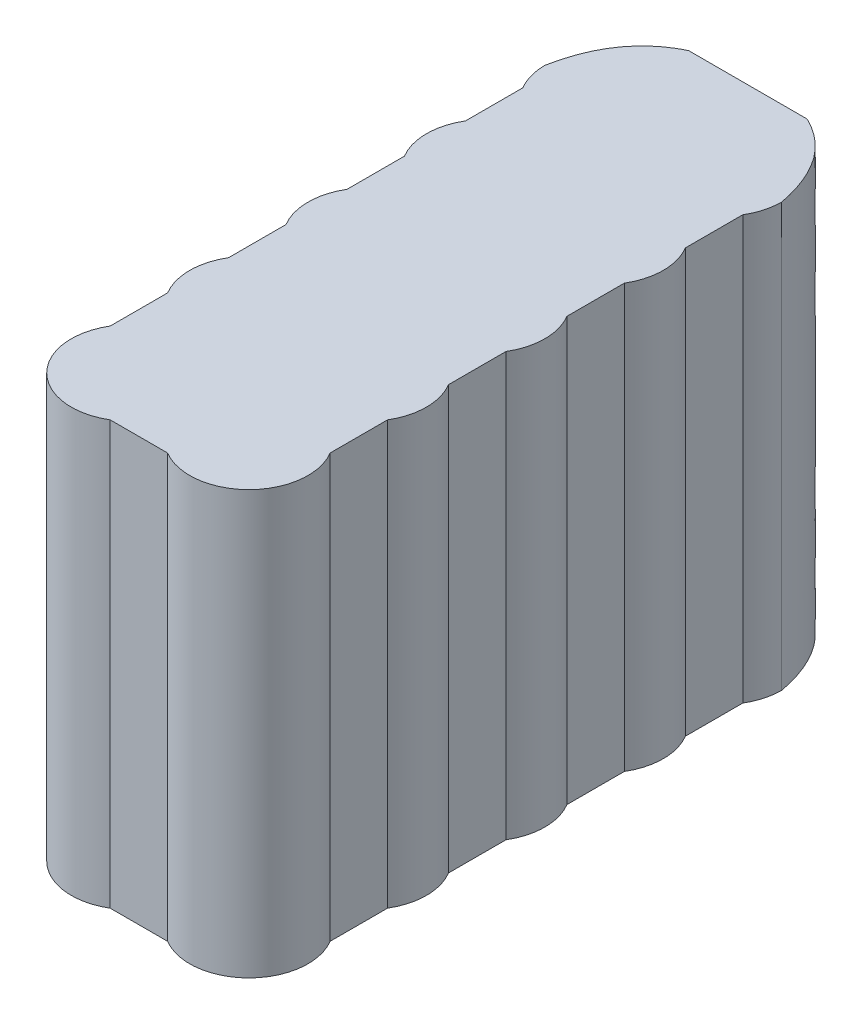
ISO-10303-21;
HEADER;
FILE_DESCRIPTION(('STEP AP214'),'2;1');
FILE_NAME('part.step','',(''),(''),'','','');
FILE_SCHEMA(('AUTOMOTIVE_DESIGN { 1 0 10303 214 1 1 1 1 }'));
ENDSEC;
DATA;
#1=APPLICATION_CONTEXT('core data for automotive mechanical design processes');
#2=APPLICATION_PROTOCOL_DEFINITION('international standard','automotive_design',2000,#1);
#3=PRODUCT_CONTEXT('',#1,'mechanical');
#4=PRODUCT('Part','Part','',(#3));
#5=PRODUCT_RELATED_PRODUCT_CATEGORY('part','',(#4));
#6=PRODUCT_DEFINITION_FORMATION('','',#4);
#7=PRODUCT_DEFINITION_CONTEXT('part definition',#1,'design');
#8=PRODUCT_DEFINITION('design','',#6,#7);
#9=PRODUCT_DEFINITION_SHAPE('','',#8);
#10=(LENGTH_UNIT() NAMED_UNIT(*) SI_UNIT(.MILLI.,.METRE.));
#11=(NAMED_UNIT(*) PLANE_ANGLE_UNIT() SI_UNIT($,.RADIAN.));
#12=(NAMED_UNIT(*) SI_UNIT($,.STERADIAN.) SOLID_ANGLE_UNIT());
#13=UNCERTAINTY_MEASURE_WITH_UNIT(LENGTH_MEASURE(1.E-05),#10,'distance_accuracy_value','');
#14=(GEOMETRIC_REPRESENTATION_CONTEXT(3) GLOBAL_UNCERTAINTY_ASSIGNED_CONTEXT((#13)) GLOBAL_UNIT_ASSIGNED_CONTEXT((#10,
#11,#12)) REPRESENTATION_CONTEXT('',''));
#15=CARTESIAN_POINT('',(0.,0.,0.));
#16=DIRECTION('',(0.,0.,1.));
#17=DIRECTION('',(1.,0.,0.));
#18=AXIS2_PLACEMENT_3D('',#15,#16,#17);
#19=CARTESIAN_POINT('',(7.00000000000001,50.,-38.));
#20=CARTESIAN_POINT('',(12.5964188115589,50.,-35.3289126191777));
#21=CARTESIAN_POINT('',(14.,50.,-27.9999999999999));
#22=B_SPLINE_CURVE_WITH_KNOTS('',2,(#19,#20,#21),.UNSPECIFIED.,.F.,.F.,(3,3),(0.6822294465507,
1.),.UNSPECIFIED.);
#23=DIRECTION('',(0.,-1.,0.));
#24=VECTOR('',#23,1.);
#25=SURFACE_OF_LINEAR_EXTRUSION('',#22,#24);
#26=CARTESIAN_POINT('',(7.00000000000001,0.,-38.));
#27=CARTESIAN_POINT('',(12.5964188115589,0.,-35.3289126191777));
#28=CARTESIAN_POINT('',(14.,0.,-27.9999999999999));
#29=B_SPLINE_CURVE_WITH_KNOTS('',2,(#26,#27,#28),.UNSPECIFIED.,.F.,.F.,(3,3),(0.6822294465507,
1.),.UNSPECIFIED.);
#30=CARTESIAN_POINT('',(7.00000000000001,0.,-38.));
#31=VERTEX_POINT('',#30);
#32=CARTESIAN_POINT('',(14.,0.,-27.9999999999999));
#33=VERTEX_POINT('',#32);
#34=EDGE_CURVE('E211',#31,#33,#29,.T.);
#35=ORIENTED_EDGE('',*,*,#34,.F.);
#36=DIRECTION('',(0.,-1.,0.));
#37=VECTOR('',#36,1.);
#38=CARTESIAN_POINT('',(7.00000000000001,50.,-38.));
#39=LINE('',#38,#37);
#40=CARTESIAN_POINT('',(7.00000000000001,50.,-38.));
#41=VERTEX_POINT('',#40);
#42=EDGE_CURVE('E11',#41,#31,#39,.T.);
#43=ORIENTED_EDGE('',*,*,#42,.F.);
#44=CARTESIAN_POINT('',(14.,50.,-27.9999999999999));
#45=VERTEX_POINT('',#44);
#46=EDGE_CURVE('E273',#41,#45,#22,.T.);
#47=ORIENTED_EDGE('',*,*,#46,.T.);
#48=DIRECTION('',(0.,-1.,0.));
#49=VECTOR('',#48,1.);
#50=CARTESIAN_POINT('',(14.,50.,-27.9999999999999));
#51=LINE('',#50,#49);
#52=EDGE_CURVE('E126',#45,#33,#51,.T.);
#53=ORIENTED_EDGE('',*,*,#52,.T.);
#54=EDGE_LOOP('',(#35,#43,#47,#53));
#55=FACE_BOUND('',#54,.T.);
#56=ADVANCED_FACE('F33',(#55),#25,.T.);
#57=CARTESIAN_POINT('',(0.,50.,-38.));
#58=DIRECTION('',(0.,0.,1.));
#59=DIRECTION('',(1.,0.,0.));
#60=AXIS2_PLACEMENT_3D('',#57,#58,#59);
#61=PLANE('',#60);
#62=DIRECTION('',(-1.,0.,0.));
#63=VECTOR('',#62,1.);
#64=CARTESIAN_POINT('',(0.,0.,-38.));
#65=LINE('',#64,#63);
#66=CARTESIAN_POINT('',(-6.99999999999999,0.,-38.));
#67=VERTEX_POINT('',#66);
#68=EDGE_CURVE('E216',#31,#67,#65,.T.);
#69=ORIENTED_EDGE('',*,*,#68,.T.);
#70=DIRECTION('',(0.,-1.,0.));
#71=VECTOR('',#70,1.);
#72=CARTESIAN_POINT('',(-6.99999999999999,50.,-38.));
#73=LINE('',#72,#71);
#74=CARTESIAN_POINT('',(-6.99999999999999,50.,-38.));
#75=VERTEX_POINT('',#74);
#76=EDGE_CURVE('E42',#75,#67,#73,.T.);
#77=ORIENTED_EDGE('',*,*,#76,.F.);
#78=DIRECTION('',(-1.,0.,0.));
#79=VECTOR('',#78,1.);
#80=CARTESIAN_POINT('',(0.,50.,-38.));
#81=LINE('',#80,#79);
#82=EDGE_CURVE('E381',#41,#75,#81,.T.);
#83=ORIENTED_EDGE('',*,*,#82,.F.);
#84=ORIENTED_EDGE('',*,*,#42,.T.);
#85=EDGE_LOOP('',(#69,#77,#83,#84));
#86=FACE_BOUND('',#85,.T.);
#87=ADVANCED_FACE('F327',(#86),#61,.F.);
#88=CARTESIAN_POINT('',(-14.,50.,-27.9999999999999));
#89=CARTESIAN_POINT('',(-12.5964188115868,50.,-35.3289126191844));
#90=CARTESIAN_POINT('',(-6.99999999999999,50.,-38.));
#91=B_SPLINE_CURVE_WITH_KNOTS('',2,(#88,#89,#90),.UNSPECIFIED.,.F.,.F.,(3,3),(0.,
0.317770553450376),.UNSPECIFIED.);
#92=DIRECTION('',(0.,-1.,0.));
#93=VECTOR('',#92,1.);
#94=SURFACE_OF_LINEAR_EXTRUSION('',#91,#93);
#95=CARTESIAN_POINT('',(-14.,0.,-27.9999999999999));
#96=CARTESIAN_POINT('',(-12.5964188115868,0.,-35.3289126191844));
#97=CARTESIAN_POINT('',(-6.99999999999999,0.,-38.));
#98=B_SPLINE_CURVE_WITH_KNOTS('',2,(#95,#96,#97),.UNSPECIFIED.,.F.,.F.,(3,3),(0.,
0.317770553450376),.UNSPECIFIED.);
#99=CARTESIAN_POINT('',(-14.,0.,-27.9999999999999));
#100=VERTEX_POINT('',#99);
#101=EDGE_CURVE('E222',#100,#67,#98,.T.);
#102=ORIENTED_EDGE('',*,*,#101,.F.);
#103=DIRECTION('',(0.,-1.,0.));
#104=VECTOR('',#103,1.);
#105=CARTESIAN_POINT('',(-14.,50.,-27.9999999999999));
#106=LINE('',#105,#104);
#107=CARTESIAN_POINT('',(-14.,50.,-27.9999999999999));
#108=VERTEX_POINT('',#107);
#109=EDGE_CURVE('E317',#108,#100,#106,.T.);
#110=ORIENTED_EDGE('',*,*,#109,.F.);
#111=EDGE_CURVE('E324',#108,#75,#91,.T.);
#112=ORIENTED_EDGE('',*,*,#111,.T.);
#113=ORIENTED_EDGE('',*,*,#76,.T.);
#114=EDGE_LOOP('',(#102,#110,#112,#113));
#115=FACE_BOUND('',#114,.T.);
#116=ADVANCED_FACE('F322',(#115),#94,.T.);
#117=CARTESIAN_POINT('',(-6.99999999999999,50.,-27.9999999999999));
#118=DIRECTION('',(0.,-1.,0.));
#119=DIRECTION('',(0.,0.,-1.));
#120=AXIS2_PLACEMENT_3D('',#117,#118,#119);
#121=CYLINDRICAL_SURFACE('',#120,7.00000000000002);
#122=CARTESIAN_POINT('',(-6.99999999999999,0.,-27.9999999999999));
#123=DIRECTION('',(0.,1.,0.));
#124=DIRECTION('',(0.,0.,1.));
#125=AXIS2_PLACEMENT_3D('',#122,#123,#124);
#126=CIRCLE('',#125,7.00000000000002);
#127=CARTESIAN_POINT('',(-13.,0.,-24.3944487245359));
#128=VERTEX_POINT('',#127);
#129=EDGE_CURVE('E227',#100,#128,#126,.T.);
#130=ORIENTED_EDGE('',*,*,#129,.T.);
#131=DIRECTION('',(0.,-1.,0.));
#132=VECTOR('',#131,1.);
#133=CARTESIAN_POINT('',(-13.,50.,-24.3944487245359));
#134=LINE('',#133,#132);
#135=CARTESIAN_POINT('',(-13.,50.,-24.3944487245359));
#136=VERTEX_POINT('',#135);
#137=EDGE_CURVE('E314',#136,#128,#134,.T.);
#138=ORIENTED_EDGE('',*,*,#137,.F.);
#139=CARTESIAN_POINT('',(-6.99999999999999,50.,-27.9999999999999));
#140=DIRECTION('',(0.,1.,0.));
#141=DIRECTION('',(0.,0.,1.));
#142=AXIS2_PLACEMENT_3D('',#139,#140,#141);
#143=CIRCLE('',#142,7.00000000000002);
#144=EDGE_CURVE('E344',#108,#136,#143,.T.);
#145=ORIENTED_EDGE('',*,*,#144,.F.);
#146=ORIENTED_EDGE('',*,*,#109,.T.);
#147=EDGE_LOOP('',(#130,#138,#145,#146));
#148=FACE_BOUND('',#147,.T.);
#149=ADVANCED_FACE('F335',(#148),#121,.T.);
#150=CARTESIAN_POINT('',(-13.,50.,0.));
#151=DIRECTION('',(1.,0.,0.));
#152=DIRECTION('',(0.,0.,-1.));
#153=AXIS2_PLACEMENT_3D('',#150,#151,#152);
#154=PLANE('',#153);
#155=DIRECTION('',(0.,0.,1.));
#156=VECTOR('',#155,1.);
#157=CARTESIAN_POINT('',(-13.,0.,0.));
#158=LINE('',#157,#156);
#159=CARTESIAN_POINT('',(-13.,0.,-17.6055512754637));
#160=VERTEX_POINT('',#159);
#161=EDGE_CURVE('E232',#128,#160,#158,.T.);
#162=ORIENTED_EDGE('',*,*,#161,.T.);
#163=DIRECTION('',(0.,-1.,0.));
#164=VECTOR('',#163,1.);
#165=CARTESIAN_POINT('',(-13.,50.,-17.6055512754637));
#166=LINE('',#165,#164);
#167=CARTESIAN_POINT('',(-13.,50.,-17.6055512754637));
#168=VERTEX_POINT('',#167);
#169=EDGE_CURVE('E311',#168,#160,#166,.T.);
#170=ORIENTED_EDGE('',*,*,#169,.F.);
#171=DIRECTION('',(0.,0.,1.));
#172=VECTOR('',#171,1.);
#173=CARTESIAN_POINT('',(-13.,50.,0.));
#174=LINE('',#173,#172);
#175=EDGE_CURVE('E341',#136,#168,#174,.T.);
#176=ORIENTED_EDGE('',*,*,#175,.F.);
#177=ORIENTED_EDGE('',*,*,#137,.T.);
#178=EDGE_LOOP('',(#162,#170,#176,#177));
#179=FACE_BOUND('',#178,.T.);
#180=ADVANCED_FACE('F339',(#179),#154,.F.);
#181=CARTESIAN_POINT('',(-6.99999999999985,50.,-13.9999999999999));
#182=DIRECTION('',(0.,-1.,0.));
#183=DIRECTION('',(0.,0.,-1.));
#184=AXIS2_PLACEMENT_3D('',#181,#182,#183);
#185=CYLINDRICAL_SURFACE('',#184,7.);
#186=CARTESIAN_POINT('',(-6.99999999999985,0.,-13.9999999999999));
#187=DIRECTION('',(0.,1.,0.));
#188=DIRECTION('',(0.,0.,1.));
#189=AXIS2_PLACEMENT_3D('',#186,#187,#188);
#190=CIRCLE('',#189,7.);
#191=CARTESIAN_POINT('',(-13.,0.,-10.3944487245362));
#192=VERTEX_POINT('',#191);
#193=EDGE_CURVE('E234',#160,#192,#190,.T.);
#194=ORIENTED_EDGE('',*,*,#193,.T.);
#195=DIRECTION('',(0.,-1.,0.));
#196=VECTOR('',#195,1.);
#197=CARTESIAN_POINT('',(-13.,50.,-10.3944487245362));
#198=LINE('',#197,#196);
#199=CARTESIAN_POINT('',(-13.,50.,-10.3944487245362));
#200=VERTEX_POINT('',#199);
#201=EDGE_CURVE('E308',#200,#192,#198,.T.);
#202=ORIENTED_EDGE('',*,*,#201,.F.);
#203=CARTESIAN_POINT('',(-6.99999999999985,50.,-13.9999999999999));
#204=DIRECTION('',(0.,1.,0.));
#205=DIRECTION('',(0.,0.,1.));
#206=AXIS2_PLACEMENT_3D('',#203,#204,#205);
#207=CIRCLE('',#206,7.);
#208=EDGE_CURVE('E343',#168,#200,#207,.T.);
#209=ORIENTED_EDGE('',*,*,#208,.F.);
#210=ORIENTED_EDGE('',*,*,#169,.T.);
#211=EDGE_LOOP('',(#194,#202,#209,#210));
#212=FACE_BOUND('',#211,.T.);
#213=ADVANCED_FACE('F431',(#212),#185,.T.);
#214=CARTESIAN_POINT('',(-13.,50.,0.));
#215=DIRECTION('',(1.,0.,0.));
#216=DIRECTION('',(0.,0.,-1.));
#217=AXIS2_PLACEMENT_3D('',#214,#215,#216);
#218=PLANE('',#217);
#219=DIRECTION('',(0.,0.,1.));
#220=VECTOR('',#219,1.);
#221=CARTESIAN_POINT('',(-13.,0.,0.));
#222=LINE('',#221,#220);
#223=CARTESIAN_POINT('',(-13.,0.,-3.60555127546341));
#224=VERTEX_POINT('',#223);
#225=EDGE_CURVE('E236',#192,#224,#222,.T.);
#226=ORIENTED_EDGE('',*,*,#225,.T.);
#227=DIRECTION('',(0.,-1.,0.));
#228=VECTOR('',#227,1.);
#229=CARTESIAN_POINT('',(-13.,50.,-3.60555127546341));
#230=LINE('',#229,#228);
#231=CARTESIAN_POINT('',(-13.,50.,-3.60555127546341));
#232=VERTEX_POINT('',#231);
#233=EDGE_CURVE('E305',#232,#224,#230,.T.);
#234=ORIENTED_EDGE('',*,*,#233,.F.);
#235=DIRECTION('',(0.,0.,1.));
#236=VECTOR('',#235,1.);
#237=CARTESIAN_POINT('',(-13.,50.,0.));
#238=LINE('',#237,#236);
#239=EDGE_CURVE('E346',#200,#232,#238,.T.);
#240=ORIENTED_EDGE('',*,*,#239,.F.);
#241=ORIENTED_EDGE('',*,*,#201,.T.);
#242=EDGE_LOOP('',(#226,#234,#240,#241));
#243=FACE_BOUND('',#242,.T.);
#244=ADVANCED_FACE('F439',(#243),#218,.F.);
#245=CARTESIAN_POINT('',(-6.9999999999997,50.,0.));
#246=DIRECTION('',(0.,-1.,0.));
#247=DIRECTION('',(0.,0.,-1.));
#248=AXIS2_PLACEMENT_3D('',#245,#246,#247);
#249=CYLINDRICAL_SURFACE('',#248,7.);
#250=CARTESIAN_POINT('',(-6.9999999999997,0.,0.));
#251=DIRECTION('',(0.,1.,0.));
#252=DIRECTION('',(0.,0.,1.));
#253=AXIS2_PLACEMENT_3D('',#250,#251,#252);
#254=CIRCLE('',#253,7.);
#255=CARTESIAN_POINT('',(-13.,0.,3.6055512754636));
#256=VERTEX_POINT('',#255);
#257=EDGE_CURVE('E238',#224,#256,#254,.T.);
#258=ORIENTED_EDGE('',*,*,#257,.T.);
#259=DIRECTION('',(0.,-1.,0.));
#260=VECTOR('',#259,1.);
#261=CARTESIAN_POINT('',(-13.,50.,3.6055512754636));
#262=LINE('',#261,#260);
#263=CARTESIAN_POINT('',(-13.,50.,3.6055512754636));
#264=VERTEX_POINT('',#263);
#265=EDGE_CURVE('E302',#264,#256,#262,.T.);
#266=ORIENTED_EDGE('',*,*,#265,.F.);
#267=CARTESIAN_POINT('',(-6.9999999999997,50.,0.));
#268=DIRECTION('',(0.,1.,0.));
#269=DIRECTION('',(0.,0.,1.));
#270=AXIS2_PLACEMENT_3D('',#267,#268,#269);
#271=CIRCLE('',#270,7.);
#272=EDGE_CURVE('E352',#232,#264,#271,.T.);
#273=ORIENTED_EDGE('',*,*,#272,.F.);
#274=ORIENTED_EDGE('',*,*,#233,.T.);
#275=EDGE_LOOP('',(#258,#266,#273,#274));
#276=FACE_BOUND('',#275,.T.);
#277=ADVANCED_FACE('F449',(#276),#249,.T.);
#278=CARTESIAN_POINT('',(-13.,50.,0.));
#279=DIRECTION('',(1.,0.,0.));
#280=DIRECTION('',(0.,0.,-1.));
#281=AXIS2_PLACEMENT_3D('',#278,#279,#280);
#282=PLANE('',#281);
#283=DIRECTION('',(0.,0.,1.));
#284=VECTOR('',#283,1.);
#285=CARTESIAN_POINT('',(-13.,0.,0.));
#286=LINE('',#285,#284);
#287=CARTESIAN_POINT('',(-13.,0.,10.3944487245368));
#288=VERTEX_POINT('',#287);
#289=EDGE_CURVE('E240',#256,#288,#286,.T.);
#290=ORIENTED_EDGE('',*,*,#289,.T.);
#291=DIRECTION('',(0.,-1.,0.));
#292=VECTOR('',#291,1.);
#293=CARTESIAN_POINT('',(-13.,50.,10.3944487245368));
#294=LINE('',#293,#292);
#295=CARTESIAN_POINT('',(-13.,50.,10.3944487245368));
#296=VERTEX_POINT('',#295);
#297=EDGE_CURVE('E299',#296,#288,#294,.T.);
#298=ORIENTED_EDGE('',*,*,#297,.F.);
#299=DIRECTION('',(0.,0.,1.));
#300=VECTOR('',#299,1.);
#301=CARTESIAN_POINT('',(-13.,50.,0.));
#302=LINE('',#301,#300);
#303=EDGE_CURVE('E354',#264,#296,#302,.T.);
#304=ORIENTED_EDGE('',*,*,#303,.F.);
#305=ORIENTED_EDGE('',*,*,#265,.T.);
#306=EDGE_LOOP('',(#290,#298,#304,#305));
#307=FACE_BOUND('',#306,.T.);
#308=ADVANCED_FACE('F459',(#307),#282,.F.);
#309=CARTESIAN_POINT('',(-6.99999999999956,50.,14.0000000000001));
#310=DIRECTION('',(0.,-1.,0.));
#311=DIRECTION('',(0.,0.,-1.));
#312=AXIS2_PLACEMENT_3D('',#309,#310,#311);
#313=CYLINDRICAL_SURFACE('',#312,7.);
#314=CARTESIAN_POINT('',(-6.99999999999956,0.,14.0000000000001));
#315=DIRECTION('',(0.,1.,0.));
#316=DIRECTION('',(0.,0.,1.));
#317=AXIS2_PLACEMENT_3D('',#314,#315,#316);
#318=CIRCLE('',#317,7.);
#319=CARTESIAN_POINT('',(-13.,0.,17.6055512754634));
#320=VERTEX_POINT('',#319);
#321=EDGE_CURVE('E242',#288,#320,#318,.T.);
#322=ORIENTED_EDGE('',*,*,#321,.T.);
#323=DIRECTION('',(0.,-1.,0.));
#324=VECTOR('',#323,1.);
#325=CARTESIAN_POINT('',(-13.,50.,17.6055512754634));
#326=LINE('',#325,#324);
#327=CARTESIAN_POINT('',(-13.,50.,17.6055512754634));
#328=VERTEX_POINT('',#327);
#329=EDGE_CURVE('E296',#328,#320,#326,.T.);
#330=ORIENTED_EDGE('',*,*,#329,.F.);
#331=CARTESIAN_POINT('',(-6.99999999999956,50.,14.0000000000001));
#332=DIRECTION('',(0.,1.,0.));
#333=DIRECTION('',(0.,0.,1.));
#334=AXIS2_PLACEMENT_3D('',#331,#332,#333);
#335=CIRCLE('',#334,7.);
#336=EDGE_CURVE('E356',#296,#328,#335,.T.);
#337=ORIENTED_EDGE('',*,*,#336,.F.);
#338=ORIENTED_EDGE('',*,*,#297,.T.);
#339=EDGE_LOOP('',(#322,#330,#337,#338));
#340=FACE_BOUND('',#339,.T.);
#341=ADVANCED_FACE('F469',(#340),#313,.T.);
#342=CARTESIAN_POINT('',(-13.,50.,0.));
#343=DIRECTION('',(1.,0.,0.));
#344=DIRECTION('',(0.,0.,-1.));
#345=AXIS2_PLACEMENT_3D('',#342,#343,#344);
#346=PLANE('',#345);
#347=DIRECTION('',(0.,0.,1.));
#348=VECTOR('',#347,1.);
#349=CARTESIAN_POINT('',(-13.,0.,0.));
#350=LINE('',#349,#348);
#351=CARTESIAN_POINT('',(-13.,0.,24.3944487245371));
#352=VERTEX_POINT('',#351);
#353=EDGE_CURVE('E244',#320,#352,#350,.T.);
#354=ORIENTED_EDGE('',*,*,#353,.T.);
#355=DIRECTION('',(0.,-1.,0.));
#356=VECTOR('',#355,1.);
#357=CARTESIAN_POINT('',(-13.,50.,24.3944487245371));
#358=LINE('',#357,#356);
#359=CARTESIAN_POINT('',(-13.,50.,24.3944487245371));
#360=VERTEX_POINT('',#359);
#361=EDGE_CURVE('E293',#360,#352,#358,.T.);
#362=ORIENTED_EDGE('',*,*,#361,.F.);
#363=DIRECTION('',(0.,0.,1.));
#364=VECTOR('',#363,1.);
#365=CARTESIAN_POINT('',(-13.,50.,0.));
#366=LINE('',#365,#364);
#367=EDGE_CURVE('E358',#328,#360,#366,.T.);
#368=ORIENTED_EDGE('',*,*,#367,.F.);
#369=ORIENTED_EDGE('',*,*,#329,.T.);
#370=EDGE_LOOP('',(#354,#362,#368,#369));
#371=FACE_BOUND('',#370,.T.);
#372=ADVANCED_FACE('F479',(#371),#346,.F.);
#373=CARTESIAN_POINT('',(-6.99999999999941,50.,28.0000000000001));
#374=DIRECTION('',(0.,-1.,0.));
#375=DIRECTION('',(0.,0.,-1.));
#376=AXIS2_PLACEMENT_3D('',#373,#374,#375);
#377=CYLINDRICAL_SURFACE('',#376,7.);
#378=CARTESIAN_POINT('',(-6.99999999999941,0.,28.0000000000001));
#379=DIRECTION('',(0.,1.,0.));
#380=DIRECTION('',(0.,0.,1.));
#381=AXIS2_PLACEMENT_3D('',#378,#379,#380);
#382=CIRCLE('',#381,7.);
#383=CARTESIAN_POINT('',(-3.39444872453527,0.,34.));
#384=VERTEX_POINT('',#383);
#385=EDGE_CURVE('E246',#352,#384,#382,.T.);
#386=ORIENTED_EDGE('',*,*,#385,.T.);
#387=DIRECTION('',(0.,-1.,0.));
#388=VECTOR('',#387,1.);
#389=CARTESIAN_POINT('',(-3.39444872453527,50.,34.));
#390=LINE('',#389,#388);
#391=CARTESIAN_POINT('',(-3.39444872453527,50.,34.));
#392=VERTEX_POINT('',#391);
#393=EDGE_CURVE('E290',#392,#384,#390,.T.);
#394=ORIENTED_EDGE('',*,*,#393,.F.);
#395=CARTESIAN_POINT('',(-6.99999999999941,50.,28.0000000000001));
#396=DIRECTION('',(0.,1.,0.));
#397=DIRECTION('',(0.,0.,1.));
#398=AXIS2_PLACEMENT_3D('',#395,#396,#397);
#399=CIRCLE('',#398,7.);
#400=EDGE_CURVE('E360',#360,#392,#399,.T.);
#401=ORIENTED_EDGE('',*,*,#400,.F.);
#402=ORIENTED_EDGE('',*,*,#361,.T.);
#403=EDGE_LOOP('',(#386,#394,#401,#402));
#404=FACE_BOUND('',#403,.T.);
#405=ADVANCED_FACE('F489',(#404),#377,.T.);
#406=CARTESIAN_POINT('',(0.,50.,34.));
#407=DIRECTION('',(0.,0.,-1.));
#408=DIRECTION('',(-1.,0.,0.));
#409=AXIS2_PLACEMENT_3D('',#406,#407,#408);
#410=PLANE('',#409);
#411=DIRECTION('',(1.,0.,0.));
#412=VECTOR('',#411,1.);
#413=CARTESIAN_POINT('',(0.,0.,34.));
#414=LINE('',#413,#412);
#415=CARTESIAN_POINT('',(3.39444872453661,0.,34.));
#416=VERTEX_POINT('',#415);
#417=EDGE_CURVE('E248',#384,#416,#414,.T.);
#418=ORIENTED_EDGE('',*,*,#417,.T.);
#419=DIRECTION('',(0.,-1.,0.));
#420=VECTOR('',#419,1.);
#421=CARTESIAN_POINT('',(3.39444872453661,50.,34.));
#422=LINE('',#421,#420);
#423=CARTESIAN_POINT('',(3.39444872453661,50.,34.));
#424=VERTEX_POINT('',#423);
#425=EDGE_CURVE('E287',#424,#416,#422,.T.);
#426=ORIENTED_EDGE('',*,*,#425,.F.);
#427=DIRECTION('',(1.,0.,0.));
#428=VECTOR('',#427,1.);
#429=CARTESIAN_POINT('',(0.,50.,34.));
#430=LINE('',#429,#428);
#431=EDGE_CURVE('E362',#392,#424,#430,.T.);
#432=ORIENTED_EDGE('',*,*,#431,.F.);
#433=ORIENTED_EDGE('',*,*,#393,.T.);
#434=EDGE_LOOP('',(#418,#426,#432,#433));
#435=FACE_BOUND('',#434,.T.);
#436=ADVANCED_FACE('F499',(#435),#410,.F.);
#437=CARTESIAN_POINT('',(7.00000000000059,50.,28.));
#438=DIRECTION('',(0.,-1.,0.));
#439=DIRECTION('',(0.,0.,-1.));
#440=AXIS2_PLACEMENT_3D('',#437,#438,#439);
#441=CYLINDRICAL_SURFACE('',#440,7.);
#442=CARTESIAN_POINT('',(7.00000000000059,0.,28.));
#443=DIRECTION('',(0.,1.,0.));
#444=DIRECTION('',(0.,0.,1.));
#445=AXIS2_PLACEMENT_3D('',#442,#443,#444);
#446=CIRCLE('',#445,7.);
#447=CARTESIAN_POINT('',(13.,0.,24.394448724535));
#448=VERTEX_POINT('',#447);
#449=EDGE_CURVE('E250',#416,#448,#446,.T.);
#450=ORIENTED_EDGE('',*,*,#449,.T.);
#451=DIRECTION('',(0.,-1.,0.));
#452=VECTOR('',#451,1.);
#453=CARTESIAN_POINT('',(13.,50.,24.394448724535));
#454=LINE('',#453,#452);
#455=CARTESIAN_POINT('',(13.,50.,24.394448724535));
#456=VERTEX_POINT('',#455);
#457=EDGE_CURVE('E285',#456,#448,#454,.T.);
#458=ORIENTED_EDGE('',*,*,#457,.F.);
#459=CARTESIAN_POINT('',(7.00000000000059,50.,28.));
#460=DIRECTION('',(0.,1.,0.));
#461=DIRECTION('',(0.,0.,1.));
#462=AXIS2_PLACEMENT_3D('',#459,#460,#461);
#463=CIRCLE('',#462,7.);
#464=EDGE_CURVE('E364',#424,#456,#463,.T.);
#465=ORIENTED_EDGE('',*,*,#464,.F.);
#466=ORIENTED_EDGE('',*,*,#425,.T.);
#467=EDGE_LOOP('',(#450,#458,#465,#466));
#468=FACE_BOUND('',#467,.T.);
#469=ADVANCED_FACE('F509',(#468),#441,.T.);
#470=CARTESIAN_POINT('',(13.,50.,0.));
#471=DIRECTION('',(1.,0.,0.));
#472=DIRECTION('',(0.,0.,-1.));
#473=AXIS2_PLACEMENT_3D('',#470,#471,#472);
#474=PLANE('',#473);
#475=DIRECTION('',(0.,0.,1.));
#476=VECTOR('',#475,1.);
#477=CARTESIAN_POINT('',(13.,0.,0.));
#478=LINE('',#477,#476);
#479=CARTESIAN_POINT('',(13.,0.,17.6055512754647));
#480=VERTEX_POINT('',#479);
#481=EDGE_CURVE('E253',#480,#448,#478,.T.);
#482=ORIENTED_EDGE('',*,*,#481,.F.);
#483=DIRECTION('',(0.,-1.,0.));
#484=VECTOR('',#483,1.);
#485=CARTESIAN_POINT('',(13.,50.,17.6055512754647));
#486=LINE('',#485,#484);
#487=CARTESIAN_POINT('',(13.,50.,17.6055512754647));
#488=VERTEX_POINT('',#487);
#489=EDGE_CURVE('E283',#488,#480,#486,.T.);
#490=ORIENTED_EDGE('',*,*,#489,.F.);
#491=DIRECTION('',(0.,0.,1.));
#492=VECTOR('',#491,1.);
#493=CARTESIAN_POINT('',(13.,50.,0.));
#494=LINE('',#493,#492);
#495=EDGE_CURVE('E366',#488,#456,#494,.T.);
#496=ORIENTED_EDGE('',*,*,#495,.T.);
#497=ORIENTED_EDGE('',*,*,#457,.T.);
#498=EDGE_LOOP('',(#482,#490,#496,#497));
#499=FACE_BOUND('',#498,.T.);
#500=ADVANCED_FACE('F519',(#499),#474,.T.);
#501=CARTESIAN_POINT('',(7.00000000000044,50.,14.));
#502=DIRECTION('',(0.,-1.,0.));
#503=DIRECTION('',(0.,0.,-1.));
#504=AXIS2_PLACEMENT_3D('',#501,#502,#503);
#505=CYLINDRICAL_SURFACE('',#504,7.);
#506=CARTESIAN_POINT('',(7.00000000000044,0.,14.));
#507=DIRECTION('',(0.,1.,0.));
#508=DIRECTION('',(0.,0.,1.));
#509=AXIS2_PLACEMENT_3D('',#506,#507,#508);
#510=CIRCLE('',#509,7.);
#511=CARTESIAN_POINT('',(13.,0.,10.3944487245353));
#512=VERTEX_POINT('',#511);
#513=EDGE_CURVE('E256',#480,#512,#510,.T.);
#514=ORIENTED_EDGE('',*,*,#513,.T.);
#515=DIRECTION('',(0.,-1.,0.));
#516=VECTOR('',#515,1.);
#517=CARTESIAN_POINT('',(13.,50.,10.3944487245353));
#518=LINE('',#517,#516);
#519=CARTESIAN_POINT('',(13.,50.,10.3944487245353));
#520=VERTEX_POINT('',#519);
#521=EDGE_CURVE('E281',#520,#512,#518,.T.);
#522=ORIENTED_EDGE('',*,*,#521,.F.);
#523=CARTESIAN_POINT('',(7.00000000000044,50.,14.));
#524=DIRECTION('',(0.,1.,0.));
#525=DIRECTION('',(0.,0.,1.));
#526=AXIS2_PLACEMENT_3D('',#523,#524,#525);
#527=CIRCLE('',#526,7.);
#528=EDGE_CURVE('E369',#488,#520,#527,.T.);
#529=ORIENTED_EDGE('',*,*,#528,.F.);
#530=ORIENTED_EDGE('',*,*,#489,.T.);
#531=EDGE_LOOP('',(#514,#522,#529,#530));
#532=FACE_BOUND('',#531,.T.);
#533=ADVANCED_FACE('F529',(#532),#505,.T.);
#534=CARTESIAN_POINT('',(13.,50.,0.));
#535=DIRECTION('',(1.,0.,0.));
#536=DIRECTION('',(0.,0.,-1.));
#537=AXIS2_PLACEMENT_3D('',#534,#535,#536);
#538=PLANE('',#537);
#539=DIRECTION('',(0.,0.,1.));
#540=VECTOR('',#539,1.);
#541=CARTESIAN_POINT('',(13.,0.,0.));
#542=LINE('',#541,#540);
#543=CARTESIAN_POINT('',(13.,0.,3.6055512754645));
#544=VERTEX_POINT('',#543);
#545=EDGE_CURVE('E259',#544,#512,#542,.T.);
#546=ORIENTED_EDGE('',*,*,#545,.F.);
#547=DIRECTION('',(0.,-1.,0.));
#548=VECTOR('',#547,1.);
#549=CARTESIAN_POINT('',(13.,50.,3.6055512754645));
#550=LINE('',#549,#548);
#551=CARTESIAN_POINT('',(13.,50.,3.6055512754645));
#552=VERTEX_POINT('',#551);
#553=EDGE_CURVE('E279',#552,#544,#550,.T.);
#554=ORIENTED_EDGE('',*,*,#553,.F.);
#555=DIRECTION('',(0.,0.,1.));
#556=VECTOR('',#555,1.);
#557=CARTESIAN_POINT('',(13.,50.,0.));
#558=LINE('',#557,#556);
#559=EDGE_CURVE('E371',#552,#520,#558,.T.);
#560=ORIENTED_EDGE('',*,*,#559,.T.);
#561=ORIENTED_EDGE('',*,*,#521,.T.);
#562=EDGE_LOOP('',(#546,#554,#560,#561));
#563=FACE_BOUND('',#562,.T.);
#564=ADVANCED_FACE('F539',(#563),#538,.T.);
#565=CARTESIAN_POINT('',(7.0000000000003,50.,0.));
#566=DIRECTION('',(0.,-1.,0.));
#567=DIRECTION('',(0.,0.,-1.));
#568=AXIS2_PLACEMENT_3D('',#565,#566,#567);
#569=CYLINDRICAL_SURFACE('',#568,7.);
#570=CARTESIAN_POINT('',(7.0000000000003,0.,0.));
#571=DIRECTION('',(0.,1.,0.));
#572=DIRECTION('',(0.,0.,1.));
#573=AXIS2_PLACEMENT_3D('',#570,#571,#572);
#574=CIRCLE('',#573,7.);
#575=CARTESIAN_POINT('',(13.,0.,-3.6055512754645));
#576=VERTEX_POINT('',#575);
#577=EDGE_CURVE('E262',#544,#576,#574,.T.);
#578=ORIENTED_EDGE('',*,*,#577,.T.);
#579=DIRECTION('',(0.,-1.,0.));
#580=VECTOR('',#579,1.);
#581=CARTESIAN_POINT('',(13.,50.,-3.6055512754645));
#582=LINE('',#581,#580);
#583=CARTESIAN_POINT('',(13.,50.,-3.6055512754645));
#584=VERTEX_POINT('',#583);
#585=EDGE_CURVE('E277',#584,#576,#582,.T.);
#586=ORIENTED_EDGE('',*,*,#585,.F.);
#587=CARTESIAN_POINT('',(7.0000000000003,50.,0.));
#588=DIRECTION('',(0.,1.,0.));
#589=DIRECTION('',(0.,0.,1.));
#590=AXIS2_PLACEMENT_3D('',#587,#588,#589);
#591=CIRCLE('',#590,7.);
#592=EDGE_CURVE('E374',#552,#584,#591,.T.);
#593=ORIENTED_EDGE('',*,*,#592,.F.);
#594=ORIENTED_EDGE('',*,*,#553,.T.);
#595=EDGE_LOOP('',(#578,#586,#593,#594));
#596=FACE_BOUND('',#595,.T.);
#597=ADVANCED_FACE('F549',(#596),#569,.T.);
#598=CARTESIAN_POINT('',(13.,50.,0.));
#599=DIRECTION('',(1.,0.,0.));
#600=DIRECTION('',(0.,0.,-1.));
#601=AXIS2_PLACEMENT_3D('',#598,#599,#600);
#602=PLANE('',#601);
#603=DIRECTION('',(0.,0.,1.));
#604=VECTOR('',#603,1.);
#605=CARTESIAN_POINT('',(13.,0.,0.));
#606=LINE('',#605,#604);
#607=CARTESIAN_POINT('',(13.,0.,-10.3944487245357));
#608=VERTEX_POINT('',#607);
#609=EDGE_CURVE('E265',#608,#576,#606,.T.);
#610=ORIENTED_EDGE('',*,*,#609,.F.);
#611=DIRECTION('',(0.,-1.,0.));
#612=VECTOR('',#611,1.);
#613=CARTESIAN_POINT('',(13.,50.,-10.3944487245357));
#614=LINE('',#613,#612);
#615=CARTESIAN_POINT('',(13.,50.,-10.3944487245357));
#616=VERTEX_POINT('',#615);
#617=EDGE_CURVE('E204',#616,#608,#614,.T.);
#618=ORIENTED_EDGE('',*,*,#617,.F.);
#619=DIRECTION('',(0.,0.,1.));
#620=VECTOR('',#619,1.);
#621=CARTESIAN_POINT('',(13.,50.,0.));
#622=LINE('',#621,#620);
#623=EDGE_CURVE('E193',#616,#584,#622,.T.);
#624=ORIENTED_EDGE('',*,*,#623,.T.);
#625=ORIENTED_EDGE('',*,*,#585,.T.);
#626=EDGE_LOOP('',(#610,#618,#624,#625));
#627=FACE_BOUND('',#626,.T.);
#628=ADVANCED_FACE('F377',(#627),#602,.T.);
#629=CARTESIAN_POINT('',(7.00000000000015,50.,-14.));
#630=DIRECTION('',(0.,-1.,0.));
#631=DIRECTION('',(0.,0.,-1.));
#632=AXIS2_PLACEMENT_3D('',#629,#630,#631);
#633=CYLINDRICAL_SURFACE('',#632,7.);
#634=CARTESIAN_POINT('',(7.00000000000015,0.,-14.));
#635=DIRECTION('',(0.,1.,0.));
#636=DIRECTION('',(0.,0.,1.));
#637=AXIS2_PLACEMENT_3D('',#634,#635,#636);
#638=CIRCLE('',#637,7.);
#639=CARTESIAN_POINT('',(13.,0.,-17.6055512754643));
#640=VERTEX_POINT('',#639);
#641=EDGE_CURVE('E200',#608,#640,#638,.T.);
#642=ORIENTED_EDGE('',*,*,#641,.T.);
#643=DIRECTION('',(0.,-1.,0.));
#644=VECTOR('',#643,1.);
#645=CARTESIAN_POINT('',(13.,50.,-17.6055512754643));
#646=LINE('',#645,#644);
#647=CARTESIAN_POINT('',(13.,50.,-17.6055512754643));
#648=VERTEX_POINT('',#647);
#649=EDGE_CURVE('E197',#648,#640,#646,.T.);
#650=ORIENTED_EDGE('',*,*,#649,.F.);
#651=CARTESIAN_POINT('',(7.00000000000015,50.,-14.));
#652=DIRECTION('',(0.,1.,0.));
#653=DIRECTION('',(0.,0.,1.));
#654=AXIS2_PLACEMENT_3D('',#651,#652,#653);
#655=CIRCLE('',#654,7.);
#656=EDGE_CURVE('E187',#616,#648,#655,.T.);
#657=ORIENTED_EDGE('',*,*,#656,.F.);
#658=ORIENTED_EDGE('',*,*,#617,.T.);
#659=EDGE_LOOP('',(#642,#650,#657,#658));
#660=FACE_BOUND('',#659,.T.);
#661=ADVANCED_FACE('F198',(#660),#633,.T.);
#662=CARTESIAN_POINT('',(13.,50.,0.));
#663=DIRECTION('',(1.,0.,0.));
#664=DIRECTION('',(0.,0.,-1.));
#665=AXIS2_PLACEMENT_3D('',#662,#663,#664);
#666=PLANE('',#665);
#667=DIRECTION('',(0.,0.,1.));
#668=VECTOR('',#667,1.);
#669=CARTESIAN_POINT('',(13.,0.,0.));
#670=LINE('',#669,#668);
#671=CARTESIAN_POINT('',(13.,0.,-24.394448724536));
#672=VERTEX_POINT('',#671);
#673=EDGE_CURVE('E269',#672,#640,#670,.T.);
#674=ORIENTED_EDGE('',*,*,#673,.F.);
#675=DIRECTION('',(0.,-1.,0.));
#676=VECTOR('',#675,1.);
#677=CARTESIAN_POINT('',(13.,50.,-24.394448724536));
#678=LINE('',#677,#676);
#679=CARTESIAN_POINT('',(13.,50.,-24.394448724536));
#680=VERTEX_POINT('',#679);
#681=EDGE_CURVE('E119',#680,#672,#678,.T.);
#682=ORIENTED_EDGE('',*,*,#681,.F.);
#683=DIRECTION('',(0.,0.,1.));
#684=VECTOR('',#683,1.);
#685=CARTESIAN_POINT('',(13.,50.,0.));
#686=LINE('',#685,#684);
#687=EDGE_CURVE('E191',#680,#648,#686,.T.);
#688=ORIENTED_EDGE('',*,*,#687,.T.);
#689=ORIENTED_EDGE('',*,*,#649,.T.);
#690=EDGE_LOOP('',(#674,#682,#688,#689));
#691=FACE_BOUND('',#690,.T.);
#692=ADVANCED_FACE('F206',(#691),#666,.T.);
#693=CARTESIAN_POINT('',(7.00000000000001,50.,-28.));
#694=DIRECTION('',(0.,-1.,0.));
#695=DIRECTION('',(0.,0.,-1.));
#696=AXIS2_PLACEMENT_3D('',#693,#694,#695);
#697=CYLINDRICAL_SURFACE('',#696,7.);
#698=CARTESIAN_POINT('',(7.00000000000001,0.,-28.));
#699=DIRECTION('',(0.,1.,0.));
#700=DIRECTION('',(0.,0.,1.));
#701=AXIS2_PLACEMENT_3D('',#698,#699,#700);
#702=CIRCLE('',#701,7.);
#703=EDGE_CURVE('E271',#672,#33,#702,.T.);
#704=ORIENTED_EDGE('',*,*,#703,.T.);
#705=ORIENTED_EDGE('',*,*,#52,.F.);
#706=CARTESIAN_POINT('',(7.00000000000001,50.,-28.));
#707=DIRECTION('',(0.,1.,0.));
#708=DIRECTION('',(0.,0.,1.));
#709=AXIS2_PLACEMENT_3D('',#706,#707,#708);
#710=CIRCLE('',#709,7.);
#711=EDGE_CURVE('E50',#680,#45,#710,.T.);
#712=ORIENTED_EDGE('',*,*,#711,.F.);
#713=ORIENTED_EDGE('',*,*,#681,.T.);
#714=EDGE_LOOP('',(#704,#705,#712,#713));
#715=FACE_BOUND('',#714,.T.);
#716=ADVANCED_FACE('F380',(#715),#697,.T.);
#717=CARTESIAN_POINT('',(0.,50.,0.));
#718=DIRECTION('',(0.,1.,0.));
#719=DIRECTION('',(0.,0.,1.));
#720=AXIS2_PLACEMENT_3D('',#717,#718,#719);
#721=PLANE('',#720);
#722=ORIENTED_EDGE('',*,*,#46,.F.);
#723=ORIENTED_EDGE('',*,*,#82,.T.);
#724=ORIENTED_EDGE('',*,*,#111,.F.);
#725=ORIENTED_EDGE('',*,*,#144,.T.);
#726=ORIENTED_EDGE('',*,*,#175,.T.);
#727=ORIENTED_EDGE('',*,*,#208,.T.);
#728=ORIENTED_EDGE('',*,*,#239,.T.);
#729=ORIENTED_EDGE('',*,*,#272,.T.);
#730=ORIENTED_EDGE('',*,*,#303,.T.);
#731=ORIENTED_EDGE('',*,*,#336,.T.);
#732=ORIENTED_EDGE('',*,*,#367,.T.);
#733=ORIENTED_EDGE('',*,*,#400,.T.);
#734=ORIENTED_EDGE('',*,*,#431,.T.);
#735=ORIENTED_EDGE('',*,*,#464,.T.);
#736=ORIENTED_EDGE('',*,*,#495,.F.);
#737=ORIENTED_EDGE('',*,*,#528,.T.);
#738=ORIENTED_EDGE('',*,*,#559,.F.);
#739=ORIENTED_EDGE('',*,*,#592,.T.);
#740=ORIENTED_EDGE('',*,*,#623,.F.);
#741=ORIENTED_EDGE('',*,*,#656,.T.);
#742=ORIENTED_EDGE('',*,*,#687,.F.);
#743=ORIENTED_EDGE('',*,*,#711,.T.);
#744=EDGE_LOOP('',(#722,#723,#724,#725,#726,#727,#728,#729,#730,#731,#732,#733,#734,#735,#736,
#737,#738,#739,#740,#741,#742,#743));
#745=FACE_BOUND('',#744,.T.);
#746=ADVANCED_FACE('F189',(#745),#721,.T.);
#747=CARTESIAN_POINT('',(0.,0.,0.));
#748=DIRECTION('',(0.,1.,0.));
#749=DIRECTION('',(0.,0.,1.));
#750=AXIS2_PLACEMENT_3D('',#747,#748,#749);
#751=PLANE('',#750);
#752=ORIENTED_EDGE('',*,*,#34,.T.);
#753=ORIENTED_EDGE('',*,*,#703,.F.);
#754=ORIENTED_EDGE('',*,*,#673,.T.);
#755=ORIENTED_EDGE('',*,*,#641,.F.);
#756=ORIENTED_EDGE('',*,*,#609,.T.);
#757=ORIENTED_EDGE('',*,*,#577,.F.);
#758=ORIENTED_EDGE('',*,*,#545,.T.);
#759=ORIENTED_EDGE('',*,*,#513,.F.);
#760=ORIENTED_EDGE('',*,*,#481,.T.);
#761=ORIENTED_EDGE('',*,*,#449,.F.);
#762=ORIENTED_EDGE('',*,*,#417,.F.);
#763=ORIENTED_EDGE('',*,*,#385,.F.);
#764=ORIENTED_EDGE('',*,*,#353,.F.);
#765=ORIENTED_EDGE('',*,*,#321,.F.);
#766=ORIENTED_EDGE('',*,*,#289,.F.);
#767=ORIENTED_EDGE('',*,*,#257,.F.);
#768=ORIENTED_EDGE('',*,*,#225,.F.);
#769=ORIENTED_EDGE('',*,*,#193,.F.);
#770=ORIENTED_EDGE('',*,*,#161,.F.);
#771=ORIENTED_EDGE('',*,*,#129,.F.);
#772=ORIENTED_EDGE('',*,*,#101,.T.);
#773=ORIENTED_EDGE('',*,*,#68,.F.);
#774=EDGE_LOOP('',(#752,#753,#754,#755,#756,#757,#758,#759,#760,#761,#762,#763,#764,#765,#766,
#767,#768,#769,#770,#771,#772,#773));
#775=FACE_BOUND('',#774,.T.);
#776=ADVANCED_FACE('F330',(#775),#751,.F.);
#777=CLOSED_SHELL('',(#56,#87,#116,#149,#180,#213,#244,#277,#308,#341,#372,#405,#436,#469,#500,
#533,#564,#597,#628,#661,#692,#716,#746,#776));
#778=MANIFOLD_SOLID_BREP('B2',#777);
#779=ADVANCED_BREP_SHAPE_REPRESENTATION('',(#18,#778),#14);
#780=SHAPE_DEFINITION_REPRESENTATION(#9,#779);
ENDSEC;
END-ISO-10303-21;
